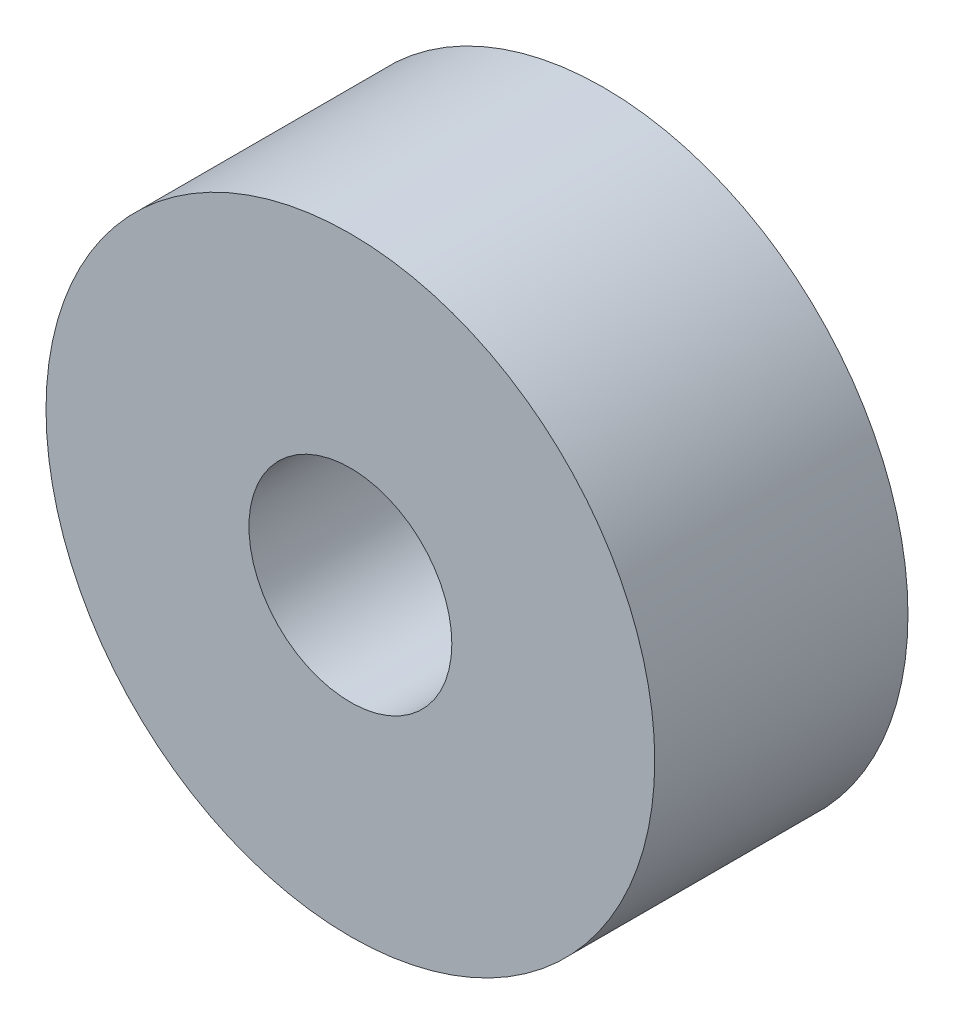
ISO-10303-21;
HEADER;
FILE_DESCRIPTION(('STEP AP214'),'2;1');
FILE_NAME('part.step','',(''),(''),'','','');
FILE_SCHEMA(('AUTOMOTIVE_DESIGN { 1 0 10303 214 1 1 1 1 }'));
ENDSEC;
DATA;
#1=APPLICATION_CONTEXT('core data for automotive mechanical design processes');
#2=APPLICATION_PROTOCOL_DEFINITION('international standard','automotive_design',2000,#1);
#3=PRODUCT_CONTEXT('',#1,'mechanical');
#4=PRODUCT('Part','Part','',(#3));
#5=PRODUCT_RELATED_PRODUCT_CATEGORY('part','',(#4));
#6=PRODUCT_DEFINITION_FORMATION('','',#4);
#7=PRODUCT_DEFINITION_CONTEXT('part definition',#1,'design');
#8=PRODUCT_DEFINITION('design','',#6,#7);
#9=PRODUCT_DEFINITION_SHAPE('','',#8);
#10=(LENGTH_UNIT() NAMED_UNIT(*) SI_UNIT(.MILLI.,.METRE.));
#11=(NAMED_UNIT(*) PLANE_ANGLE_UNIT() SI_UNIT($,.RADIAN.));
#12=(NAMED_UNIT(*) SI_UNIT($,.STERADIAN.) SOLID_ANGLE_UNIT());
#13=UNCERTAINTY_MEASURE_WITH_UNIT(LENGTH_MEASURE(1.E-05),#10,'distance_accuracy_value','');
#14=(GEOMETRIC_REPRESENTATION_CONTEXT(3) GLOBAL_UNCERTAINTY_ASSIGNED_CONTEXT((#13)) GLOBAL_UNIT_ASSIGNED_CONTEXT((#10,
#11,#12)) REPRESENTATION_CONTEXT('',''));
#15=CARTESIAN_POINT('',(0.,0.,0.));
#16=DIRECTION('',(0.,0.,1.));
#17=DIRECTION('',(1.,0.,0.));
#18=AXIS2_PLACEMENT_3D('',#15,#16,#17);
#19=CARTESIAN_POINT('',(0.,0.,3.9624));
#20=DIRECTION('',(0.,0.,1.));
#21=DIRECTION('',(1.,0.,0.));
#22=AXIS2_PLACEMENT_3D('',#19,#20,#21);
#23=PLANE('',#22);
#24=CARTESIAN_POINT('',(0.,0.,3.9624));
#25=DIRECTION('',(0.,0.,1.));
#26=DIRECTION('',(1.,0.,0.));
#27=AXIS2_PLACEMENT_3D('',#24,#25,#26);
#28=CIRCLE('',#27,4.7625);
#29=CARTESIAN_POINT('',(4.7625,0.,3.9624));
#30=VERTEX_POINT('',#29);
#31=EDGE_CURVE('E10',#30,#30,#28,.T.);
#32=ORIENTED_EDGE('',*,*,#31,.T.);
#33=EDGE_LOOP('',(#32));
#34=FACE_BOUND('',#33,.T.);
#35=CARTESIAN_POINT('',(0.,0.,3.9624));
#36=DIRECTION('',(0.,0.,1.));
#37=DIRECTION('',(1.,0.,0.));
#38=AXIS2_PLACEMENT_3D('',#35,#36,#37);
#39=CIRCLE('',#38,1.5875);
#40=CARTESIAN_POINT('',(1.5875,0.,3.9624));
#41=VERTEX_POINT('',#40);
#42=EDGE_CURVE('E42',#41,#41,#39,.T.);
#43=ORIENTED_EDGE('',*,*,#42,.F.);
#44=EDGE_LOOP('',(#43));
#45=FACE_BOUND('',#44,.T.);
#46=ADVANCED_FACE('F31',(#34,#45),#23,.T.);
#47=CARTESIAN_POINT('',(0.,0.,0.));
#48=DIRECTION('',(0.,0.,1.));
#49=DIRECTION('',(1.,0.,0.));
#50=AXIS2_PLACEMENT_3D('',#47,#48,#49);
#51=PLANE('',#50);
#52=CARTESIAN_POINT('',(0.,0.,0.));
#53=DIRECTION('',(0.,0.,1.));
#54=DIRECTION('',(1.,0.,0.));
#55=AXIS2_PLACEMENT_3D('',#52,#53,#54);
#56=CIRCLE('',#55,4.7625);
#57=CARTESIAN_POINT('',(4.7625,0.,0.));
#58=VERTEX_POINT('',#57);
#59=EDGE_CURVE('E35',#58,#58,#56,.T.);
#60=ORIENTED_EDGE('',*,*,#59,.F.);
#61=EDGE_LOOP('',(#60));
#62=FACE_BOUND('',#61,.T.);
#63=CARTESIAN_POINT('',(0.,0.,0.));
#64=DIRECTION('',(0.,0.,1.));
#65=DIRECTION('',(1.,0.,0.));
#66=AXIS2_PLACEMENT_3D('',#63,#64,#65);
#67=CIRCLE('',#66,1.5875);
#68=CARTESIAN_POINT('',(1.5875,0.,0.));
#69=VERTEX_POINT('',#68);
#70=EDGE_CURVE('E44',#69,#69,#67,.T.);
#71=ORIENTED_EDGE('',*,*,#70,.T.);
#72=EDGE_LOOP('',(#71));
#73=FACE_BOUND('',#72,.T.);
#74=ADVANCED_FACE('F54',(#62,#73),#51,.F.);
#75=CARTESIAN_POINT('',(0.,0.,3.9624));
#76=DIRECTION('',(0.,0.,-1.));
#77=DIRECTION('',(-1.,0.,0.));
#78=AXIS2_PLACEMENT_3D('',#75,#76,#77);
#79=CYLINDRICAL_SURFACE('',#78,4.7625);
#80=ORIENTED_EDGE('',*,*,#31,.F.);
#81=EDGE_LOOP('',(#80));
#82=FACE_BOUND('',#81,.T.);
#83=ORIENTED_EDGE('',*,*,#59,.T.);
#84=EDGE_LOOP('',(#83));
#85=FACE_BOUND('',#84,.T.);
#86=ADVANCED_FACE('F33',(#82,#85),#79,.T.);
#87=CARTESIAN_POINT('',(0.,0.,3.9624));
#88=DIRECTION('',(0.,0.,-1.));
#89=DIRECTION('',(-1.,0.,0.));
#90=AXIS2_PLACEMENT_3D('',#87,#88,#89);
#91=CYLINDRICAL_SURFACE('',#90,1.5875);
#92=ORIENTED_EDGE('',*,*,#42,.T.);
#93=EDGE_LOOP('',(#92));
#94=FACE_BOUND('',#93,.T.);
#95=ORIENTED_EDGE('',*,*,#70,.F.);
#96=EDGE_LOOP('',(#95));
#97=FACE_BOUND('',#96,.T.);
#98=ADVANCED_FACE('F50',(#94,#97),#91,.F.);
#99=CLOSED_SHELL('',(#46,#74,#86,#98));
#100=MANIFOLD_SOLID_BREP('B2',#99);
#101=ADVANCED_BREP_SHAPE_REPRESENTATION('',(#18,#100),#14);
#102=SHAPE_DEFINITION_REPRESENTATION(#9,#101);
ENDSEC;
END-ISO-10303-21;
